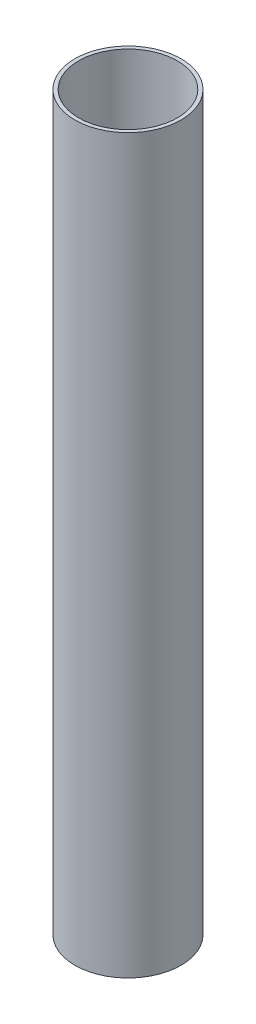
ISO-10303-21;
HEADER;
FILE_DESCRIPTION(('STEP AP214'),'2;1');
FILE_NAME('part.step','',(''),(''),'','','');
FILE_SCHEMA(('AUTOMOTIVE_DESIGN { 1 0 10303 214 1 1 1 1 }'));
ENDSEC;
DATA;
#1=APPLICATION_CONTEXT('core data for automotive mechanical design processes');
#2=APPLICATION_PROTOCOL_DEFINITION('international standard','automotive_design',2000,#1);
#3=PRODUCT_CONTEXT('',#1,'mechanical');
#4=PRODUCT('Part','Part','',(#3));
#5=PRODUCT_RELATED_PRODUCT_CATEGORY('part','',(#4));
#6=PRODUCT_DEFINITION_FORMATION('','',#4);
#7=PRODUCT_DEFINITION_CONTEXT('part definition',#1,'design');
#8=PRODUCT_DEFINITION('design','',#6,#7);
#9=PRODUCT_DEFINITION_SHAPE('','',#8);
#10=(LENGTH_UNIT() NAMED_UNIT(*) SI_UNIT(.MILLI.,.METRE.));
#11=(NAMED_UNIT(*) PLANE_ANGLE_UNIT() SI_UNIT($,.RADIAN.));
#12=(NAMED_UNIT(*) SI_UNIT($,.STERADIAN.) SOLID_ANGLE_UNIT());
#13=UNCERTAINTY_MEASURE_WITH_UNIT(LENGTH_MEASURE(1.E-05),#10,'distance_accuracy_value','');
#14=(GEOMETRIC_REPRESENTATION_CONTEXT(3) GLOBAL_UNCERTAINTY_ASSIGNED_CONTEXT((#13)) GLOBAL_UNIT_ASSIGNED_CONTEXT((#10,
#11,#12)) REPRESENTATION_CONTEXT('',''));
#15=CARTESIAN_POINT('',(0.,0.,0.));
#16=DIRECTION('',(0.,0.,1.));
#17=DIRECTION('',(1.,0.,0.));
#18=AXIS2_PLACEMENT_3D('',#15,#16,#17);
#19=CARTESIAN_POINT('',(0.,400.,0.));
#20=DIRECTION('',(0.,1.,0.));
#21=DIRECTION('',(0.,0.,1.));
#22=AXIS2_PLACEMENT_3D('',#19,#20,#21);
#23=PLANE('',#22);
#24=CARTESIAN_POINT('',(0.,400.,0.));
#25=DIRECTION('',(0.,1.,0.));
#26=DIRECTION('',(0.,0.,1.));
#27=AXIS2_PLACEMENT_3D('',#24,#25,#26);
#28=CIRCLE('',#27,29.);
#29=CARTESIAN_POINT('',(0.,400.,29.));
#30=VERTEX_POINT('',#29);
#31=EDGE_CURVE('E10',#30,#30,#28,.T.);
#32=ORIENTED_EDGE('',*,*,#31,.T.);
#33=EDGE_LOOP('',(#32));
#34=FACE_BOUND('',#33,.T.);
#35=CARTESIAN_POINT('',(0.,400.,0.));
#36=DIRECTION('',(0.,1.,0.));
#37=DIRECTION('',(0.,0.,1.));
#38=AXIS2_PLACEMENT_3D('',#35,#36,#37);
#39=CIRCLE('',#38,27.);
#40=CARTESIAN_POINT('',(0.,400.,27.));
#41=VERTEX_POINT('',#40);
#42=EDGE_CURVE('E54',#41,#41,#39,.T.);
#43=ORIENTED_EDGE('',*,*,#42,.F.);
#44=EDGE_LOOP('',(#43));
#45=FACE_BOUND('',#44,.T.);
#46=ADVANCED_FACE('F41',(#34,#45),#23,.T.);
#47=CARTESIAN_POINT('',(0.,0.,0.));
#48=DIRECTION('',(0.,1.,0.));
#49=DIRECTION('',(0.,0.,1.));
#50=AXIS2_PLACEMENT_3D('',#47,#48,#49);
#51=PLANE('',#50);
#52=CARTESIAN_POINT('',(0.,0.,0.));
#53=DIRECTION('',(0.,1.,0.));
#54=DIRECTION('',(0.,0.,1.));
#55=AXIS2_PLACEMENT_3D('',#52,#53,#54);
#56=CIRCLE('',#55,29.);
#57=CARTESIAN_POINT('',(0.,0.,29.));
#58=VERTEX_POINT('',#57);
#59=EDGE_CURVE('E45',#58,#58,#56,.T.);
#60=ORIENTED_EDGE('',*,*,#59,.F.);
#61=EDGE_LOOP('',(#60));
#62=FACE_BOUND('',#61,.T.);
#63=CARTESIAN_POINT('',(0.,0.,0.));
#64=DIRECTION('',(0.,1.,0.));
#65=DIRECTION('',(0.,0.,1.));
#66=AXIS2_PLACEMENT_3D('',#63,#64,#65);
#67=CIRCLE('',#66,27.);
#68=CARTESIAN_POINT('',(0.,0.,27.));
#69=VERTEX_POINT('',#68);
#70=EDGE_CURVE('E56',#69,#69,#67,.T.);
#71=ORIENTED_EDGE('',*,*,#70,.T.);
#72=EDGE_LOOP('',(#71));
#73=FACE_BOUND('',#72,.T.);
#74=ADVANCED_FACE('F68',(#62,#73),#51,.F.);
#75=CARTESIAN_POINT('',(0.,400.,0.));
#76=DIRECTION('',(0.,-1.,0.));
#77=DIRECTION('',(0.,0.,-1.));
#78=AXIS2_PLACEMENT_3D('',#75,#76,#77);
#79=CYLINDRICAL_SURFACE('',#78,29.);
#80=ORIENTED_EDGE('',*,*,#31,.F.);
#81=EDGE_LOOP('',(#80));
#82=FACE_BOUND('',#81,.T.);
#83=ORIENTED_EDGE('',*,*,#59,.T.);
#84=EDGE_LOOP('',(#83));
#85=FACE_BOUND('',#84,.T.);
#86=ADVANCED_FACE('F43',(#82,#85),#79,.T.);
#87=CARTESIAN_POINT('',(0.,400.,0.));
#88=DIRECTION('',(0.,-1.,0.));
#89=DIRECTION('',(0.,0.,-1.));
#90=AXIS2_PLACEMENT_3D('',#87,#88,#89);
#91=CYLINDRICAL_SURFACE('',#90,27.);
#92=ORIENTED_EDGE('',*,*,#42,.T.);
#93=EDGE_LOOP('',(#92));
#94=FACE_BOUND('',#93,.T.);
#95=ORIENTED_EDGE('',*,*,#70,.F.);
#96=EDGE_LOOP('',(#95));
#97=FACE_BOUND('',#96,.T.);
#98=ADVANCED_FACE('F64',(#94,#97),#91,.F.);
#99=CLOSED_SHELL('',(#46,#74,#86,#98));
#100=MANIFOLD_SOLID_BREP('B2',#99);
#101=ADVANCED_BREP_SHAPE_REPRESENTATION('',(#18,#100),#14);
#102=SHAPE_DEFINITION_REPRESENTATION(#9,#101);
ENDSEC;
END-ISO-10303-21;
